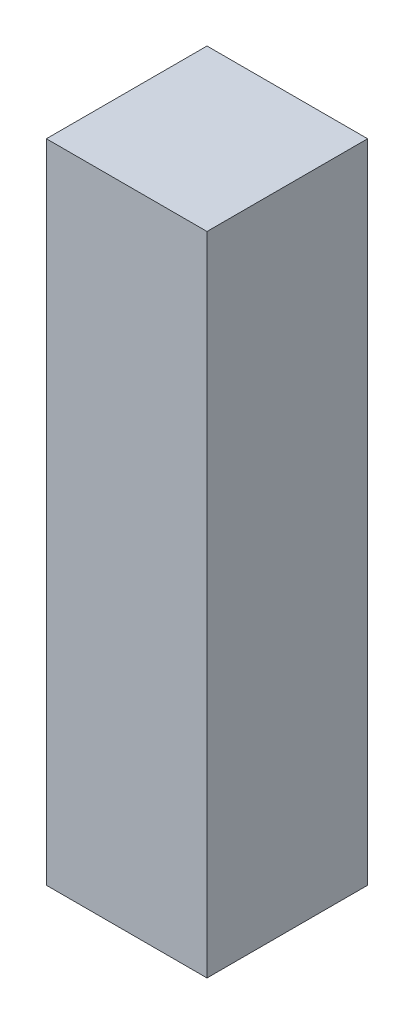
ISO-10303-21;
HEADER;
FILE_DESCRIPTION(('STEP AP214'),'2;1');
FILE_NAME('part.step','',(''),(''),'','','');
FILE_SCHEMA(('AUTOMOTIVE_DESIGN { 1 0 10303 214 1 1 1 1 }'));
ENDSEC;
DATA;
#1=APPLICATION_CONTEXT('core data for automotive mechanical design processes');
#2=APPLICATION_PROTOCOL_DEFINITION('international standard','automotive_design',2000,#1);
#3=PRODUCT_CONTEXT('',#1,'mechanical');
#4=PRODUCT('Part','Part','',(#3));
#5=PRODUCT_RELATED_PRODUCT_CATEGORY('part','',(#4));
#6=PRODUCT_DEFINITION_FORMATION('','',#4);
#7=PRODUCT_DEFINITION_CONTEXT('part definition',#1,'design');
#8=PRODUCT_DEFINITION('design','',#6,#7);
#9=PRODUCT_DEFINITION_SHAPE('','',#8);
#10=(LENGTH_UNIT() NAMED_UNIT(*) SI_UNIT(.MILLI.,.METRE.));
#11=(NAMED_UNIT(*) PLANE_ANGLE_UNIT() SI_UNIT($,.RADIAN.));
#12=(NAMED_UNIT(*) SI_UNIT($,.STERADIAN.) SOLID_ANGLE_UNIT());
#13=UNCERTAINTY_MEASURE_WITH_UNIT(LENGTH_MEASURE(1.E-05),#10,'distance_accuracy_value','');
#14=(GEOMETRIC_REPRESENTATION_CONTEXT(3) GLOBAL_UNCERTAINTY_ASSIGNED_CONTEXT((#13)) GLOBAL_UNIT_ASSIGNED_CONTEXT((#10,
#11,#12)) REPRESENTATION_CONTEXT('',''));
#15=CARTESIAN_POINT('',(0.,0.,0.));
#16=DIRECTION('',(0.,0.,1.));
#17=DIRECTION('',(1.,0.,0.));
#18=AXIS2_PLACEMENT_3D('',#15,#16,#17);
#19=CARTESIAN_POINT('',(10.,80.5,-10.));
#20=DIRECTION('',(-1.,0.,0.));
#21=DIRECTION('',(0.,0.,1.));
#22=AXIS2_PLACEMENT_3D('',#19,#20,#21);
#23=PLANE('',#22);
#24=DIRECTION('',(0.,0.,-1.));
#25=VECTOR('',#24,1.);
#26=CARTESIAN_POINT('',(10.,0.,-10.));
#27=LINE('',#26,#25);
#28=CARTESIAN_POINT('',(10.,0.,10.));
#29=VERTEX_POINT('',#28);
#30=CARTESIAN_POINT('',(10.,0.,-10.));
#31=VERTEX_POINT('',#30);
#32=EDGE_CURVE('E103',#29,#31,#27,.T.);
#33=ORIENTED_EDGE('',*,*,#32,.T.);
#34=DIRECTION('',(0.,-1.,0.));
#35=VECTOR('',#34,1.);
#36=CARTESIAN_POINT('',(10.,80.5,-10.));
#37=LINE('',#36,#35);
#38=CARTESIAN_POINT('',(10.,80.5,-10.));
#39=VERTEX_POINT('',#38);
#40=EDGE_CURVE('E11',#39,#31,#37,.T.);
#41=ORIENTED_EDGE('',*,*,#40,.F.);
#42=DIRECTION('',(0.,0.,-1.));
#43=VECTOR('',#42,1.);
#44=CARTESIAN_POINT('',(10.,80.5,-10.));
#45=LINE('',#44,#43);
#46=CARTESIAN_POINT('',(10.,80.5,10.));
#47=VERTEX_POINT('',#46);
#48=EDGE_CURVE('E91',#47,#39,#45,.T.);
#49=ORIENTED_EDGE('',*,*,#48,.F.);
#50=DIRECTION('',(0.,-1.,0.));
#51=VECTOR('',#50,1.);
#52=CARTESIAN_POINT('',(10.,80.5,10.));
#53=LINE('',#52,#51);
#54=EDGE_CURVE('E99',#47,#29,#53,.T.);
#55=ORIENTED_EDGE('',*,*,#54,.T.);
#56=EDGE_LOOP('',(#33,#41,#49,#55));
#57=FACE_BOUND('',#56,.T.);
#58=ADVANCED_FACE('F40',(#57),#23,.F.);
#59=CARTESIAN_POINT('',(-10.,80.5,-10.));
#60=DIRECTION('',(0.,0.,1.));
#61=DIRECTION('',(1.,0.,0.));
#62=AXIS2_PLACEMENT_3D('',#59,#60,#61);
#63=PLANE('',#62);
#64=DIRECTION('',(-1.,0.,0.));
#65=VECTOR('',#64,1.);
#66=CARTESIAN_POINT('',(-10.,0.,-10.));
#67=LINE('',#66,#65);
#68=CARTESIAN_POINT('',(-10.,0.,-10.));
#69=VERTEX_POINT('',#68);
#70=EDGE_CURVE('E95',#31,#69,#67,.T.);
#71=ORIENTED_EDGE('',*,*,#70,.T.);
#72=DIRECTION('',(0.,-1.,0.));
#73=VECTOR('',#72,1.);
#74=CARTESIAN_POINT('',(-10.,80.5,-10.));
#75=LINE('',#74,#73);
#76=CARTESIAN_POINT('',(-10.,80.5,-10.));
#77=VERTEX_POINT('',#76);
#78=EDGE_CURVE('E48',#77,#69,#75,.T.);
#79=ORIENTED_EDGE('',*,*,#78,.F.);
#80=DIRECTION('',(-1.,0.,0.));
#81=VECTOR('',#80,1.);
#82=CARTESIAN_POINT('',(-10.,80.5,-10.));
#83=LINE('',#82,#81);
#84=EDGE_CURVE('E86',#39,#77,#83,.T.);
#85=ORIENTED_EDGE('',*,*,#84,.F.);
#86=ORIENTED_EDGE('',*,*,#40,.T.);
#87=EDGE_LOOP('',(#71,#79,#85,#86));
#88=FACE_BOUND('',#87,.T.);
#89=ADVANCED_FACE('F94',(#88),#63,.F.);
#90=CARTESIAN_POINT('',(-10.,80.5,-10.));
#91=DIRECTION('',(1.,0.,0.));
#92=DIRECTION('',(0.,0.,-1.));
#93=AXIS2_PLACEMENT_3D('',#90,#91,#92);
#94=PLANE('',#93);
#95=DIRECTION('',(0.,0.,1.));
#96=VECTOR('',#95,1.);
#97=CARTESIAN_POINT('',(-10.,0.,-10.));
#98=LINE('',#97,#96);
#99=CARTESIAN_POINT('',(-10.,0.,10.));
#100=VERTEX_POINT('',#99);
#101=EDGE_CURVE('E73',#69,#100,#98,.T.);
#102=ORIENTED_EDGE('',*,*,#101,.T.);
#103=DIRECTION('',(0.,-1.,0.));
#104=VECTOR('',#103,1.);
#105=CARTESIAN_POINT('',(-10.,80.5,10.));
#106=LINE('',#105,#104);
#107=CARTESIAN_POINT('',(-10.,80.5,10.));
#108=VERTEX_POINT('',#107);
#109=EDGE_CURVE('E96',#108,#100,#106,.T.);
#110=ORIENTED_EDGE('',*,*,#109,.F.);
#111=DIRECTION('',(0.,0.,1.));
#112=VECTOR('',#111,1.);
#113=CARTESIAN_POINT('',(-10.,80.5,-10.));
#114=LINE('',#113,#112);
#115=EDGE_CURVE('E89',#77,#108,#114,.T.);
#116=ORIENTED_EDGE('',*,*,#115,.F.);
#117=ORIENTED_EDGE('',*,*,#78,.T.);
#118=EDGE_LOOP('',(#102,#110,#116,#117));
#119=FACE_BOUND('',#118,.T.);
#120=ADVANCED_FACE('F97',(#119),#94,.F.);
#121=CARTESIAN_POINT('',(-10.,80.5,10.));
#122=DIRECTION('',(0.,0.,-1.));
#123=DIRECTION('',(-1.,0.,0.));
#124=AXIS2_PLACEMENT_3D('',#121,#122,#123);
#125=PLANE('',#124);
#126=DIRECTION('',(1.,0.,0.));
#127=VECTOR('',#126,1.);
#128=CARTESIAN_POINT('',(-10.,0.,10.));
#129=LINE('',#128,#127);
#130=EDGE_CURVE('E79',#100,#29,#129,.T.);
#131=ORIENTED_EDGE('',*,*,#130,.T.);
#132=ORIENTED_EDGE('',*,*,#54,.F.);
#133=DIRECTION('',(1.,0.,0.));
#134=VECTOR('',#133,1.);
#135=CARTESIAN_POINT('',(-10.,80.5,10.));
#136=LINE('',#135,#134);
#137=EDGE_CURVE('E56',#108,#47,#136,.T.);
#138=ORIENTED_EDGE('',*,*,#137,.F.);
#139=ORIENTED_EDGE('',*,*,#109,.T.);
#140=EDGE_LOOP('',(#131,#132,#138,#139));
#141=FACE_BOUND('',#140,.T.);
#142=ADVANCED_FACE('F110',(#141),#125,.F.);
#143=CARTESIAN_POINT('',(0.,80.5,0.));
#144=DIRECTION('',(0.,1.,0.));
#145=DIRECTION('',(0.,0.,1.));
#146=AXIS2_PLACEMENT_3D('',#143,#144,#145);
#147=PLANE('',#146);
#148=ORIENTED_EDGE('',*,*,#48,.T.);
#149=ORIENTED_EDGE('',*,*,#84,.T.);
#150=ORIENTED_EDGE('',*,*,#115,.T.);
#151=ORIENTED_EDGE('',*,*,#137,.T.);
#152=EDGE_LOOP('',(#148,#149,#150,#151));
#153=FACE_BOUND('',#152,.T.);
#154=ADVANCED_FACE('F87',(#153),#147,.T.);
#155=CARTESIAN_POINT('',(0.,0.,0.));
#156=DIRECTION('',(0.,1.,0.));
#157=DIRECTION('',(0.,0.,1.));
#158=AXIS2_PLACEMENT_3D('',#155,#156,#157);
#159=PLANE('',#158);
#160=ORIENTED_EDGE('',*,*,#32,.F.);
#161=ORIENTED_EDGE('',*,*,#130,.F.);
#162=ORIENTED_EDGE('',*,*,#101,.F.);
#163=ORIENTED_EDGE('',*,*,#70,.F.);
#164=EDGE_LOOP('',(#160,#161,#162,#163));
#165=FACE_BOUND('',#164,.T.);
#166=ADVANCED_FACE('F113',(#165),#159,.F.);
#167=CLOSED_SHELL('',(#58,#89,#120,#142,#154,#166));
#168=MANIFOLD_SOLID_BREP('B2',#167);
#169=ADVANCED_BREP_SHAPE_REPRESENTATION('',(#18,#168),#14);
#170=SHAPE_DEFINITION_REPRESENTATION(#9,#169);
ENDSEC;
END-ISO-10303-21;
